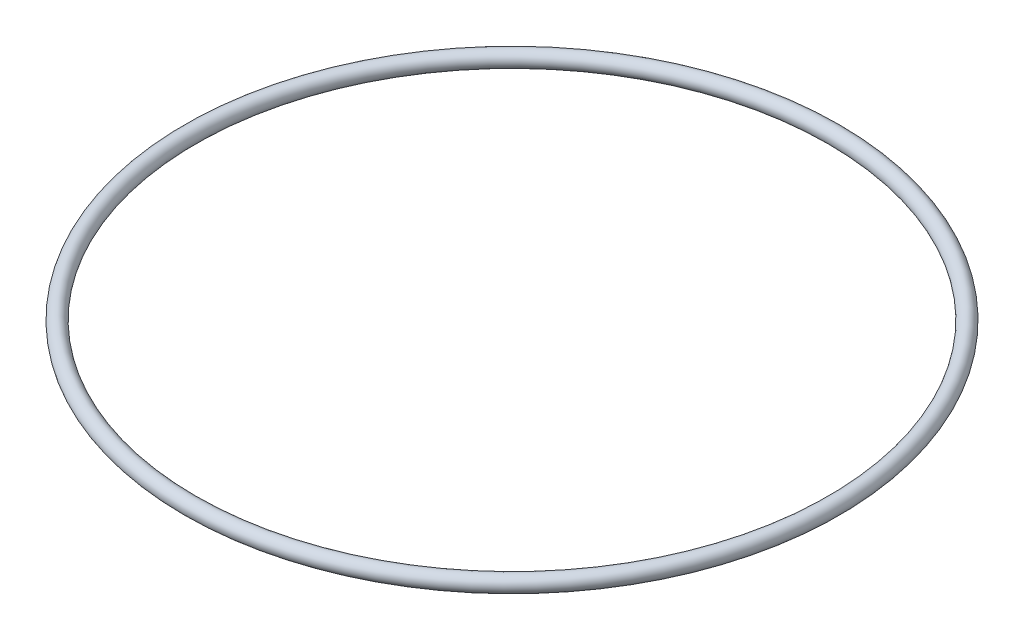
ISO-10303-21;
HEADER;
FILE_DESCRIPTION(('STEP AP214'),'2;1');
FILE_NAME('part.step','',(''),(''),'','','');
FILE_SCHEMA(('AUTOMOTIVE_DESIGN { 1 0 10303 214 1 1 1 1 }'));
ENDSEC;
DATA;
#1=APPLICATION_CONTEXT('core data for automotive mechanical design processes');
#2=APPLICATION_PROTOCOL_DEFINITION('international standard','automotive_design',2000,#1);
#3=PRODUCT_CONTEXT('',#1,'mechanical');
#4=PRODUCT('Part','Part','',(#3));
#5=PRODUCT_RELATED_PRODUCT_CATEGORY('part','',(#4));
#6=PRODUCT_DEFINITION_FORMATION('','',#4);
#7=PRODUCT_DEFINITION_CONTEXT('part definition',#1,'design');
#8=PRODUCT_DEFINITION('design','',#6,#7);
#9=PRODUCT_DEFINITION_SHAPE('','',#8);
#10=(LENGTH_UNIT() NAMED_UNIT(*) SI_UNIT(.MILLI.,.METRE.));
#11=(NAMED_UNIT(*) PLANE_ANGLE_UNIT() SI_UNIT($,.RADIAN.));
#12=(NAMED_UNIT(*) SI_UNIT($,.STERADIAN.) SOLID_ANGLE_UNIT());
#13=UNCERTAINTY_MEASURE_WITH_UNIT(LENGTH_MEASURE(1.E-05),#10,'distance_accuracy_value','');
#14=(GEOMETRIC_REPRESENTATION_CONTEXT(3) GLOBAL_UNCERTAINTY_ASSIGNED_CONTEXT((#13)) GLOBAL_UNIT_ASSIGNED_CONTEXT((#10,
#11,#12)) REPRESENTATION_CONTEXT('',''));
#15=CARTESIAN_POINT('',(0.,0.,0.));
#16=DIRECTION('',(0.,0.,1.));
#17=DIRECTION('',(1.,0.,0.));
#18=AXIS2_PLACEMENT_3D('',#15,#16,#17);
#19=CARTESIAN_POINT('',(0.,0.,0.));
#20=DIRECTION('',(0.,-1.,0.));
#21=DIRECTION('',(0.,0.,-1.));
#22=AXIS2_PLACEMENT_3D('',#19,#20,#21);
#23=TOROIDAL_SURFACE('',#22,61.5,1.5);
#24=CARTESIAN_POINT('',(0.,0.,-63.));
#25=VERTEX_POINT('',#24);
#26=VERTEX_LOOP('',#25);
#27=FACE_BOUND('',#26,.T.);
#28=ADVANCED_FACE('F39',(#27),#23,.T.);
#29=CLOSED_SHELL('',(#28));
#30=MANIFOLD_SOLID_BREP('B2',#29);
#31=ADVANCED_BREP_SHAPE_REPRESENTATION('',(#18,#30),#14);
#32=SHAPE_DEFINITION_REPRESENTATION(#9,#31);
ENDSEC;
END-ISO-10303-21;
